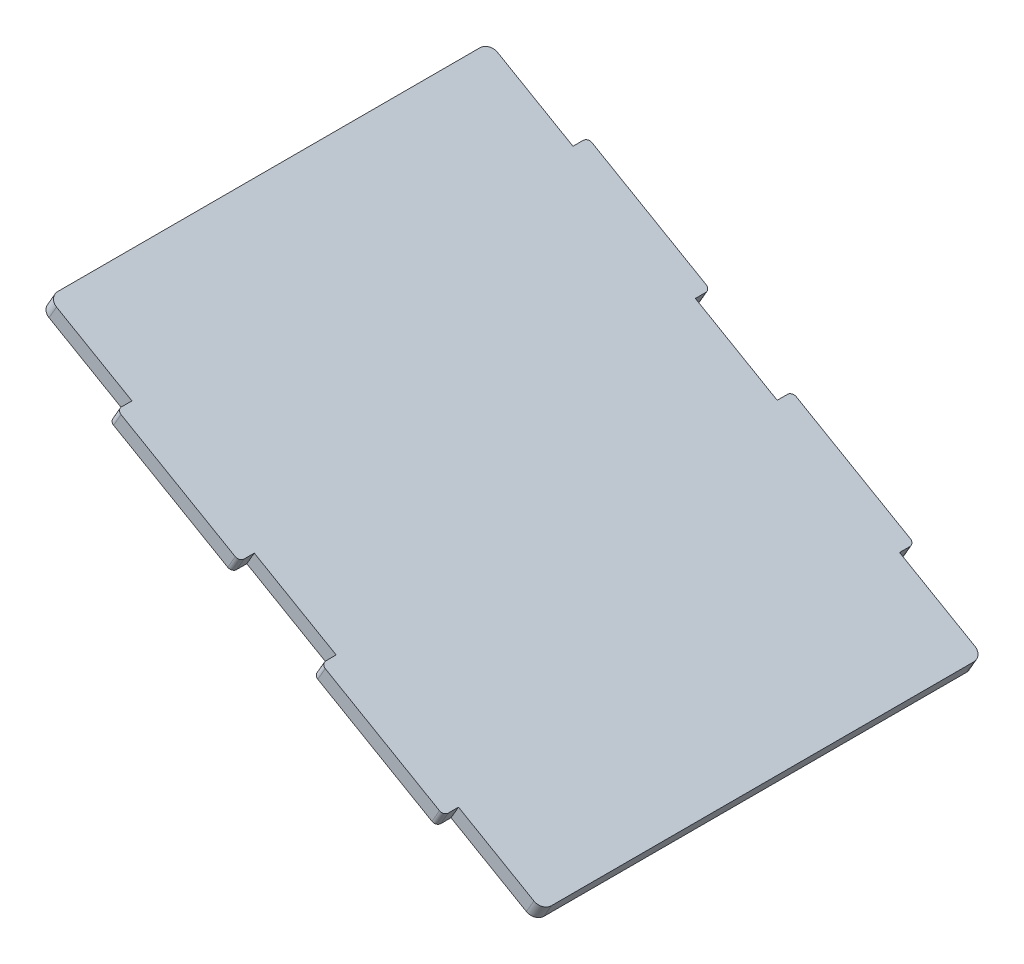
ISO-10303-21;
HEADER;
FILE_DESCRIPTION(('STEP AP214'),'2;1');
FILE_NAME('part.step','',(''),(''),'','','');
FILE_SCHEMA(('AUTOMOTIVE_DESIGN { 1 0 10303 214 1 1 1 1 }'));
ENDSEC;
DATA;
#1=APPLICATION_CONTEXT('core data for automotive mechanical design processes');
#2=APPLICATION_PROTOCOL_DEFINITION('international standard','automotive_design',2000,#1);
#3=PRODUCT_CONTEXT('',#1,'mechanical');
#4=PRODUCT('Part','Part','',(#3));
#5=PRODUCT_RELATED_PRODUCT_CATEGORY('part','',(#4));
#6=PRODUCT_DEFINITION_FORMATION('','',#4);
#7=PRODUCT_DEFINITION_CONTEXT('part definition',#1,'design');
#8=PRODUCT_DEFINITION('design','',#6,#7);
#9=PRODUCT_DEFINITION_SHAPE('','',#8);
#10=(LENGTH_UNIT() NAMED_UNIT(*) SI_UNIT(.MILLI.,.METRE.));
#11=(NAMED_UNIT(*) PLANE_ANGLE_UNIT() SI_UNIT($,.RADIAN.));
#12=(NAMED_UNIT(*) SI_UNIT($,.STERADIAN.) SOLID_ANGLE_UNIT());
#13=UNCERTAINTY_MEASURE_WITH_UNIT(LENGTH_MEASURE(1.E-05),#10,'distance_accuracy_value','');
#14=(GEOMETRIC_REPRESENTATION_CONTEXT(3) GLOBAL_UNCERTAINTY_ASSIGNED_CONTEXT((#13)) GLOBAL_UNIT_ASSIGNED_CONTEXT((#10,
#11,#12)) REPRESENTATION_CONTEXT('',''));
#15=CARTESIAN_POINT('',(0.,0.,0.));
#16=DIRECTION('',(0.,0.,1.));
#17=DIRECTION('',(1.,0.,0.));
#18=AXIS2_PLACEMENT_3D('',#15,#16,#17);
#19=CARTESIAN_POINT('',(0.,0.,1.5875));
#20=DIRECTION('',(0.,0.,-1.));
#21=DIRECTION('',(-1.,0.,0.));
#22=AXIS2_PLACEMENT_3D('',#19,#20,#21);
#23=PLANE('',#22);
#24=DIRECTION('',(0.866025403784438,-0.500000000000001,0.));
#25=VECTOR('',#24,1.);
#26=CARTESIAN_POINT('',(-89.5336436170212,-1.28136737596979,1.5875));
#27=LINE('',#26,#25);
#28=CARTESIAN_POINT('',(-70.925552896104,-12.0247535627964,1.5875));
#29=VERTEX_POINT('',#28);
#30=CARTESIAN_POINT('',(-46.6768415901397,-26.0247535627964,1.5875));
#31=VERTEX_POINT('',#30);
#32=EDGE_CURVE('E407',#29,#31,#27,.T.);
#33=ORIENTED_EDGE('',*,*,#32,.T.);
#34=DIRECTION('',(-0.500000000000002,-0.866025403784437,0.));
#35=VECTOR('',#34,1.);
#36=CARTESIAN_POINT('',(-23.738582336299,13.7054769020424,1.5875));
#37=LINE('',#36,#35);
#38=CARTESIAN_POINT('',(-45.0893415901397,-23.2751229057808,1.5875));
#39=VERTEX_POINT('',#38);
#40=EDGE_CURVE('E41',#31,#39,#37,.F.);
#41=ORIENTED_EDGE('',*,*,#40,.T.);
#42=DIRECTION('',(0.866025403784438,-0.500000000000001,0.));
#43=VECTOR('',#42,1.);
#44=CARTESIAN_POINT('',(-87.9461436170212,1.46826328104581,1.5875));
#45=LINE('',#44,#43);
#46=CARTESIAN_POINT('',(-69.338052896104,-9.27512290578077,1.5875));
#47=VERTEX_POINT('',#46);
#48=EDGE_CURVE('E404',#47,#39,#45,.T.);
#49=ORIENTED_EDGE('',*,*,#48,.F.);
#50=DIRECTION('',(0.500000000000002,0.866025403784437,0.));
#51=VECTOR('',#50,1.);
#52=CARTESIAN_POINT('',(-47.9872936422633,27.7054769020425,1.5875));
#53=LINE('',#52,#51);
#54=EDGE_CURVE('E398',#47,#29,#53,.F.);
#55=ORIENTED_EDGE('',*,*,#54,.T.);
#56=EDGE_LOOP('',(#33,#41,#49,#55));
#57=FACE_BOUND('',#56,.T.);
#58=ADVANCED_FACE('F33',(#57),#23,.F.);
#59=CARTESIAN_POINT('',(16.8788563829788,-59.0524786867569,-222.213793241764));
#60=DIRECTION('',(-0.866025403784439,0.499999999999999,0.));
#61=DIRECTION('',(-0.499999999999999,-0.866025403784439,0.));
#62=AXIS2_PLACEMENT_3D('',#59,#60,#61);
#63=PLANE('',#62);
#64=DIRECTION('',(0.,0.,1.));
#65=VECTOR('',#64,1.);
#66=CARTESIAN_POINT('',(15.2913563829788,-61.8021093437725,-222.213793241764));
#67=LINE('',#66,#65);
#68=CARTESIAN_POINT('',(15.2913563829788,-61.8021093437725,-93.2375));
#69=VERTEX_POINT('',#68);
#70=CARTESIAN_POINT('',(15.2913563829788,-61.8021093437725,-3.58750000000005));
#71=VERTEX_POINT('',#70);
#72=EDGE_CURVE('E415',#69,#71,#67,.T.);
#73=ORIENTED_EDGE('',*,*,#72,.F.);
#74=DIRECTION('',(0.499999999999999,0.866025403784439,0.));
#75=VECTOR('',#74,1.);
#76=CARTESIAN_POINT('',(16.8788563829788,-59.0524786867569,-93.2375));
#77=LINE('',#76,#75);
#78=CARTESIAN_POINT('',(16.8788563829788,-59.0524786867569,-93.2375));
#79=VERTEX_POINT('',#78);
#80=EDGE_CURVE('E303',#69,#79,#77,.T.);
#81=ORIENTED_EDGE('',*,*,#80,.T.);
#82=DIRECTION('',(0.,0.,1.));
#83=VECTOR('',#82,1.);
#84=CARTESIAN_POINT('',(16.8788563829788,-59.0524786867569,-222.213793241764));
#85=LINE('',#84,#83);
#86=CARTESIAN_POINT('',(16.8788563829788,-59.0524786867569,-3.58750000000005));
#87=VERTEX_POINT('',#86);
#88=EDGE_CURVE('E490',#79,#87,#85,.T.);
#89=ORIENTED_EDGE('',*,*,#88,.T.);
#90=DIRECTION('',(0.499999999999999,0.866025403784439,0.));
#91=VECTOR('',#90,1.);
#92=CARTESIAN_POINT('',(15.2913563829788,-61.8021093437725,-3.5875));
#93=LINE('',#92,#91);
#94=EDGE_CURVE('E301',#87,#71,#93,.F.);
#95=ORIENTED_EDGE('',*,*,#94,.T.);
#96=EDGE_LOOP('',(#73,#81,#89,#95));
#97=FACE_BOUND('',#96,.T.);
#98=ADVANCED_FACE('F580',(#97),#63,.F.);
#99=CARTESIAN_POINT('',(-87.9461436170212,1.46826328104581,-222.213793241764));
#100=DIRECTION('',(-0.500000000000001,-0.866025403784438,0.));
#101=DIRECTION('',(0.866025403784438,-0.500000000000001,0.));
#102=AXIS2_PLACEMENT_3D('',#99,#100,#101);
#103=PLANE('',#102);
#104=DIRECTION('',(-0.866025403784438,0.500000000000001,0.));
#105=VECTOR('',#104,1.);
#106=CARTESIAN_POINT('',(-87.9461436170212,1.46826328104581,-98.4125));
#107=LINE('',#106,#105);
#108=CARTESIAN_POINT('',(-45.0893415901397,-23.2751229057808,-98.4125));
#109=VERTEX_POINT('',#108);
#110=CARTESIAN_POINT('',(-69.338052896104,-9.27512290578076,-98.4125));
#111=VERTEX_POINT('',#110);
#112=EDGE_CURVE('E479',#109,#111,#107,.T.);
#113=ORIENTED_EDGE('',*,*,#112,.T.);
#114=CARTESIAN_POINT('',(-69.338052896104,-9.27512290578076,-97.4125));
#115=DIRECTION('',(-0.500000000000001,-0.866025403784438,0.));
#116=DIRECTION('',(0.866025403784438,-0.500000000000001,0.));
#117=AXIS2_PLACEMENT_3D('',#114,#115,#116);
#118=CIRCLE('',#117,1.);
#119=CARTESIAN_POINT('',(-70.2040782998884,-8.77512290578076,-97.4125));
#120=VERTEX_POINT('',#119);
#121=EDGE_CURVE('E357',#111,#120,#118,.F.);
#122=ORIENTED_EDGE('',*,*,#121,.T.);
#123=DIRECTION('',(0.,0.,1.));
#124=VECTOR('',#123,1.);
#125=CARTESIAN_POINT('',(-70.2040782998884,-8.77512290578076,-222.213793241764));
#126=LINE('',#125,#124);
#127=CARTESIAN_POINT('',(-70.2040782998884,-8.77512290578076,-95.2375));
#128=VERTEX_POINT('',#127);
#129=EDGE_CURVE('E459',#120,#128,#126,.T.);
#130=ORIENTED_EDGE('',*,*,#129,.T.);
#131=DIRECTION('',(-0.866025403784438,0.500000000000001,0.));
#132=VECTOR('',#131,1.);
#133=CARTESIAN_POINT('',(-87.9461436170212,1.46826328104581,-95.2375));
#134=LINE('',#133,#132);
#135=CARTESIAN_POINT('',(-86.2140928094523,0.4682632810458,-95.2375));
#136=VERTEX_POINT('',#135);
#137=EDGE_CURVE('E461',#128,#136,#134,.T.);
#138=ORIENTED_EDGE('',*,*,#137,.T.);
#139=CARTESIAN_POINT('',(-86.2140928094523,0.468263281045801,-93.2375));
#140=DIRECTION('',(-0.500000000000001,-0.866025403784438,0.));
#141=DIRECTION('',(0.866025403784438,-0.500000000000001,0.));
#142=AXIS2_PLACEMENT_3D('',#139,#140,#141);
#143=CIRCLE('',#142,2.);
#144=CARTESIAN_POINT('',(-87.9461436170212,1.46826328104581,-93.2375));
#145=VERTEX_POINT('',#144);
#146=EDGE_CURVE('E308',#136,#145,#143,.F.);
#147=ORIENTED_EDGE('',*,*,#146,.T.);
#148=DIRECTION('',(0.,0.,1.));
#149=VECTOR('',#148,1.);
#150=CARTESIAN_POINT('',(-87.9461436170212,1.46826328104581,-222.213793241764));
#151=LINE('',#150,#149);
#152=CARTESIAN_POINT('',(-87.9461436170212,1.46826328104581,-3.58750000000005));
#153=VERTEX_POINT('',#152);
#154=EDGE_CURVE('E487',#145,#153,#151,.T.);
#155=ORIENTED_EDGE('',*,*,#154,.T.);
#156=CARTESIAN_POINT('',(-86.2140928094524,0.468263281045801,-3.5875));
#157=DIRECTION('',(-0.500000000000001,-0.866025403784438,0.));
#158=DIRECTION('',(0.866025403784438,-0.500000000000001,0.));
#159=AXIS2_PLACEMENT_3D('',#156,#157,#158);
#160=CIRCLE('',#159,2.);
#161=CARTESIAN_POINT('',(-86.2140928094523,0.4682632810458,-1.58749999999999));
#162=VERTEX_POINT('',#161);
#163=EDGE_CURVE('E306',#153,#162,#160,.F.);
#164=ORIENTED_EDGE('',*,*,#163,.T.);
#165=DIRECTION('',(-0.866025403784438,0.500000000000001,0.));
#166=VECTOR('',#165,1.);
#167=CARTESIAN_POINT('',(-87.9461436170212,1.46826328104581,-1.58749999999999));
#168=LINE('',#167,#166);
#169=CARTESIAN_POINT('',(-70.2040782998884,-8.77512290578076,-1.5875));
#170=VERTEX_POINT('',#169);
#171=EDGE_CURVE('E473',#170,#162,#168,.T.);
#172=ORIENTED_EDGE('',*,*,#171,.F.);
#173=DIRECTION('',(0.,0.,1.));
#174=VECTOR('',#173,1.);
#175=CARTESIAN_POINT('',(-70.2040782998884,-8.77512290578076,-222.213793241764));
#176=LINE('',#175,#174);
#177=CARTESIAN_POINT('',(-70.2040782998884,-8.77512290578076,0.587499999999991));
#178=VERTEX_POINT('',#177);
#179=EDGE_CURVE('E471',#170,#178,#176,.T.);
#180=ORIENTED_EDGE('',*,*,#179,.T.);
#181=CARTESIAN_POINT('',(-69.338052896104,-9.27512290578076,0.5875));
#182=DIRECTION('',(-0.500000000000001,-0.866025403784438,0.));
#183=DIRECTION('',(0.866025403784438,-0.500000000000001,0.));
#184=AXIS2_PLACEMENT_3D('',#181,#182,#183);
#185=CIRCLE('',#184,1.);
#186=EDGE_CURVE('E343',#178,#47,#185,.F.);
#187=ORIENTED_EDGE('',*,*,#186,.T.);
#188=ORIENTED_EDGE('',*,*,#48,.T.);
#189=CARTESIAN_POINT('',(-45.0893415901397,-23.2751229057808,0.5875));
#190=DIRECTION('',(-0.500000000000001,-0.866025403784438,0.));
#191=DIRECTION('',(0.866025403784438,-0.500000000000001,0.));
#192=AXIS2_PLACEMENT_3D('',#189,#190,#191);
#193=CIRCLE('',#192,1.);
#194=CARTESIAN_POINT('',(-44.2233161863553,-23.7751229057808,0.587499999999991));
#195=VERTEX_POINT('',#194);
#196=EDGE_CURVE('E345',#39,#195,#193,.F.);
#197=ORIENTED_EDGE('',*,*,#196,.T.);
#198=DIRECTION('',(0.,0.,-1.));
#199=VECTOR('',#198,1.);
#200=CARTESIAN_POINT('',(-44.2233161863553,-23.7751229057808,-222.213793241764));
#201=LINE('',#200,#199);
#202=CARTESIAN_POINT('',(-44.2233161863553,-23.7751229057808,-1.5875));
#203=VERTEX_POINT('',#202);
#204=EDGE_CURVE('E425',#195,#203,#201,.T.);
#205=ORIENTED_EDGE('',*,*,#204,.T.);
#206=CARTESIAN_POINT('',(-26.8439710476872,-33.8090924999303,-1.5875));
#207=VERTEX_POINT('',#206);
#208=EDGE_CURVE('E433',#207,#203,#168,.T.);
#209=ORIENTED_EDGE('',*,*,#208,.F.);
#210=DIRECTION('',(0.,0.,1.));
#211=VECTOR('',#210,1.);
#212=CARTESIAN_POINT('',(-26.8439710476872,-33.8090924999303,-222.213793241764));
#213=LINE('',#212,#211);
#214=CARTESIAN_POINT('',(-26.8439710476872,-33.8090924999303,0.587499999999991));
#215=VERTEX_POINT('',#214);
#216=EDGE_CURVE('E465',#207,#215,#213,.T.);
#217=ORIENTED_EDGE('',*,*,#216,.T.);
#218=CARTESIAN_POINT('',(-25.9779456439027,-34.3090924999303,0.5875));
#219=DIRECTION('',(-0.500000000000001,-0.866025403784438,0.));
#220=DIRECTION('',(0.866025403784438,-0.500000000000001,0.));
#221=AXIS2_PLACEMENT_3D('',#218,#219,#220);
#222=CIRCLE('',#221,1.);
#223=CARTESIAN_POINT('',(-25.9779456439027,-34.3090924999303,1.5875));
#224=VERTEX_POINT('',#223);
#225=EDGE_CURVE('E347',#215,#224,#222,.F.);
#226=ORIENTED_EDGE('',*,*,#225,.T.);
#227=CARTESIAN_POINT('',(-1.72923433793847,-48.3090924999303,1.5875));
#228=VERTEX_POINT('',#227);
#229=EDGE_CURVE('E416',#224,#228,#45,.T.);
#230=ORIENTED_EDGE('',*,*,#229,.T.);
#231=CARTESIAN_POINT('',(-1.72923433793849,-48.3090924999303,0.5875));
#232=DIRECTION('',(-0.500000000000001,-0.866025403784438,0.));
#233=DIRECTION('',(0.866025403784438,-0.500000000000001,0.));
#234=AXIS2_PLACEMENT_3D('',#231,#232,#233);
#235=CIRCLE('',#234,1.);
#236=CARTESIAN_POINT('',(-0.863208934154064,-48.8090924999303,0.587499999999991));
#237=VERTEX_POINT('',#236);
#238=EDGE_CURVE('E349',#228,#237,#235,.F.);
#239=ORIENTED_EDGE('',*,*,#238,.T.);
#240=DIRECTION('',(0.,0.,-1.));
#241=VECTOR('',#240,1.);
#242=CARTESIAN_POINT('',(-0.863208934154064,-48.8090924999303,-222.213793241764));
#243=LINE('',#242,#241);
#244=CARTESIAN_POINT('',(-0.86320893415405,-48.8090924999303,-1.5875));
#245=VERTEX_POINT('',#244);
#246=EDGE_CURVE('E468',#237,#245,#243,.T.);
#247=ORIENTED_EDGE('',*,*,#246,.T.);
#248=CARTESIAN_POINT('',(15.1468055754099,-58.0524786867569,-1.58749999999999));
#249=VERTEX_POINT('',#248);
#250=EDGE_CURVE('E476',#249,#245,#168,.T.);
#251=ORIENTED_EDGE('',*,*,#250,.F.);
#252=CARTESIAN_POINT('',(15.1468055754099,-58.0524786867569,-3.5875));
#253=DIRECTION('',(-0.500000000000001,-0.866025403784438,0.));
#254=DIRECTION('',(0.866025403784438,-0.500000000000001,0.));
#255=AXIS2_PLACEMENT_3D('',#252,#253,#254);
#256=CIRCLE('',#255,2.);
#257=EDGE_CURVE('E310',#249,#87,#256,.F.);
#258=ORIENTED_EDGE('',*,*,#257,.T.);
#259=ORIENTED_EDGE('',*,*,#88,.F.);
#260=CARTESIAN_POINT('',(15.1468055754099,-58.0524786867569,-93.2375));
#261=DIRECTION('',(-0.500000000000001,-0.866025403784438,0.));
#262=DIRECTION('',(0.866025403784438,-0.500000000000001,0.));
#263=AXIS2_PLACEMENT_3D('',#260,#261,#262);
#264=CIRCLE('',#263,2.);
#265=CARTESIAN_POINT('',(15.1468055754099,-58.0524786867569,-95.2375));
#266=VERTEX_POINT('',#265);
#267=EDGE_CURVE('E312',#79,#266,#264,.F.);
#268=ORIENTED_EDGE('',*,*,#267,.T.);
#269=CARTESIAN_POINT('',(-0.863208934154045,-48.8090924999303,-95.2375));
#270=VERTEX_POINT('',#269);
#271=EDGE_CURVE('E464',#266,#270,#134,.T.);
#272=ORIENTED_EDGE('',*,*,#271,.T.);
#273=DIRECTION('',(0.,0.,-1.));
#274=VECTOR('',#273,1.);
#275=CARTESIAN_POINT('',(-0.863208934154064,-48.8090924999303,-222.213793241764));
#276=LINE('',#275,#274);
#277=CARTESIAN_POINT('',(-0.863208934154064,-48.8090924999303,-97.4125));
#278=VERTEX_POINT('',#277);
#279=EDGE_CURVE('E450',#270,#278,#276,.T.);
#280=ORIENTED_EDGE('',*,*,#279,.T.);
#281=CARTESIAN_POINT('',(-1.72923433793848,-48.3090924999303,-97.4125));
#282=DIRECTION('',(-0.500000000000001,-0.866025403784438,0.));
#283=DIRECTION('',(0.866025403784438,-0.500000000000001,0.));
#284=AXIS2_PLACEMENT_3D('',#281,#282,#283);
#285=CIRCLE('',#284,1.);
#286=CARTESIAN_POINT('',(-1.72923433793848,-48.3090924999303,-98.4125));
#287=VERTEX_POINT('',#286);
#288=EDGE_CURVE('E351',#278,#287,#285,.F.);
#289=ORIENTED_EDGE('',*,*,#288,.T.);
#290=CARTESIAN_POINT('',(-25.9779456439027,-34.3090924999303,-98.4125));
#291=VERTEX_POINT('',#290);
#292=EDGE_CURVE('E477',#287,#291,#107,.T.);
#293=ORIENTED_EDGE('',*,*,#292,.T.);
#294=CARTESIAN_POINT('',(-25.9779456439027,-34.3090924999303,-97.4125));
#295=DIRECTION('',(-0.500000000000001,-0.866025403784438,0.));
#296=DIRECTION('',(0.866025403784438,-0.500000000000001,0.));
#297=AXIS2_PLACEMENT_3D('',#294,#295,#296);
#298=CIRCLE('',#297,1.);
#299=CARTESIAN_POINT('',(-26.8439710476872,-33.8090924999303,-97.4125));
#300=VERTEX_POINT('',#299);
#301=EDGE_CURVE('E353',#291,#300,#298,.F.);
#302=ORIENTED_EDGE('',*,*,#301,.T.);
#303=DIRECTION('',(0.,0.,1.));
#304=VECTOR('',#303,1.);
#305=CARTESIAN_POINT('',(-26.8439710476872,-33.8090924999303,-222.213793241764));
#306=LINE('',#305,#304);
#307=CARTESIAN_POINT('',(-26.8439710476872,-33.8090924999303,-95.2375));
#308=VERTEX_POINT('',#307);
#309=EDGE_CURVE('E250',#300,#308,#306,.T.);
#310=ORIENTED_EDGE('',*,*,#309,.T.);
#311=CARTESIAN_POINT('',(-44.2233161863553,-23.7751229057808,-95.2375));
#312=VERTEX_POINT('',#311);
#313=EDGE_CURVE('E260',#308,#312,#134,.T.);
#314=ORIENTED_EDGE('',*,*,#313,.T.);
#315=DIRECTION('',(0.,0.,-1.));
#316=VECTOR('',#315,1.);
#317=CARTESIAN_POINT('',(-44.2233161863553,-23.7751229057808,-222.213793241764));
#318=LINE('',#317,#316);
#319=CARTESIAN_POINT('',(-44.2233161863553,-23.7751229057808,-97.4125));
#320=VERTEX_POINT('',#319);
#321=EDGE_CURVE('E454',#312,#320,#318,.T.);
#322=ORIENTED_EDGE('',*,*,#321,.T.);
#323=CARTESIAN_POINT('',(-45.0893415901397,-23.2751229057808,-97.4125));
#324=DIRECTION('',(-0.500000000000001,-0.866025403784438,0.));
#325=DIRECTION('',(0.866025403784438,-0.500000000000001,0.));
#326=AXIS2_PLACEMENT_3D('',#323,#324,#325);
#327=CIRCLE('',#326,1.);
#328=EDGE_CURVE('E355',#320,#109,#327,.F.);
#329=ORIENTED_EDGE('',*,*,#328,.T.);
#330=EDGE_LOOP('',(#113,#122,#130,#138,#147,#155,#164,#172,#180,#187,#188,#197,#205,#209,#217,
#226,#230,#239,#247,#251,#258,#259,#268,#272,#280,#289,#293,#302,#310,#314,#322,#329));
#331=FACE_BOUND('',#330,.T.);
#332=ADVANCED_FACE('F412',(#331),#103,.F.);
#333=CARTESIAN_POINT('',(-89.5336436170212,-1.28136737596979,-222.213793241764));
#334=DIRECTION('',(0.86602540378444,-0.499999999999998,0.));
#335=DIRECTION('',(0.499999999999998,0.86602540378444,0.));
#336=AXIS2_PLACEMENT_3D('',#333,#334,#335);
#337=PLANE('',#336);
#338=ORIENTED_EDGE('',*,*,#154,.F.);
#339=DIRECTION('',(-0.499999999999998,-0.86602540378444,0.));
#340=VECTOR('',#339,1.);
#341=CARTESIAN_POINT('',(-89.5336436170212,-1.28136737596979,-93.2375));
#342=LINE('',#341,#340);
#343=CARTESIAN_POINT('',(-89.5336436170212,-1.28136737596979,-93.2375));
#344=VERTEX_POINT('',#343);
#345=EDGE_CURVE('E329',#145,#344,#342,.T.);
#346=ORIENTED_EDGE('',*,*,#345,.T.);
#347=DIRECTION('',(0.,0.,1.));
#348=VECTOR('',#347,1.);
#349=CARTESIAN_POINT('',(-89.5336436170212,-1.28136737596979,-222.213793241764));
#350=LINE('',#349,#348);
#351=CARTESIAN_POINT('',(-89.5336436170212,-1.28136737596979,-3.58750000000005));
#352=VERTEX_POINT('',#351);
#353=EDGE_CURVE('E484',#344,#352,#350,.T.);
#354=ORIENTED_EDGE('',*,*,#353,.T.);
#355=DIRECTION('',(-0.499999999999998,-0.86602540378444,0.));
#356=VECTOR('',#355,1.);
#357=CARTESIAN_POINT('',(-87.9461436170212,1.46826328104579,-3.5875));
#358=LINE('',#357,#356);
#359=EDGE_CURVE('E327',#352,#153,#358,.F.);
#360=ORIENTED_EDGE('',*,*,#359,.T.);
#361=EDGE_LOOP('',(#338,#346,#354,#360));
#362=FACE_BOUND('',#361,.T.);
#363=ADVANCED_FACE('F543',(#362),#337,.F.);
#364=CARTESIAN_POINT('',(-89.5336436170212,-1.28136737596979,-222.213793241764));
#365=DIRECTION('',(-0.500000000000001,-0.866025403784438,0.));
#366=DIRECTION('',(0.866025403784438,-0.500000000000001,0.));
#367=AXIS2_PLACEMENT_3D('',#364,#365,#366);
#368=PLANE('',#367);
#369=DIRECTION('',(0.,0.,1.));
#370=VECTOR('',#369,1.);
#371=CARTESIAN_POINT('',(-71.7915782998884,-11.5247535627963,-222.213793241764));
#372=LINE('',#371,#370);
#373=CARTESIAN_POINT('',(-71.7915782998884,-11.5247535627963,-97.4125));
#374=VERTEX_POINT('',#373);
#375=CARTESIAN_POINT('',(-71.7915782998884,-11.5247535627963,-95.2375));
#376=VERTEX_POINT('',#375);
#377=EDGE_CURVE('E457',#374,#376,#372,.T.);
#378=ORIENTED_EDGE('',*,*,#377,.F.);
#379=CARTESIAN_POINT('',(-70.925552896104,-12.0247535627964,-97.4125));
#380=DIRECTION('',(-0.500000000000001,-0.866025403784438,0.));
#381=DIRECTION('',(0.866025403784438,-0.500000000000001,0.));
#382=AXIS2_PLACEMENT_3D('',#379,#380,#381);
#383=CIRCLE('',#382,1.);
#384=CARTESIAN_POINT('',(-70.925552896104,-12.0247535627963,-98.4125));
#385=VERTEX_POINT('',#384);
#386=EDGE_CURVE('E373',#374,#385,#383,.T.);
#387=ORIENTED_EDGE('',*,*,#386,.T.);
#388=DIRECTION('',(-0.866025403784438,0.500000000000001,0.));
#389=VECTOR('',#388,1.);
#390=CARTESIAN_POINT('',(-89.5336436170212,-1.28136737596979,-98.4125));
#391=LINE('',#390,#389);
#392=CARTESIAN_POINT('',(-46.6768415901397,-26.0247535627964,-98.4125));
#393=VERTEX_POINT('',#392);
#394=EDGE_CURVE('E273',#393,#385,#391,.T.);
#395=ORIENTED_EDGE('',*,*,#394,.F.);
#396=CARTESIAN_POINT('',(-46.6768415901397,-26.0247535627964,-97.4125));
#397=DIRECTION('',(-0.500000000000001,-0.866025403784438,0.));
#398=DIRECTION('',(0.866025403784438,-0.500000000000001,0.));
#399=AXIS2_PLACEMENT_3D('',#396,#397,#398);
#400=CIRCLE('',#399,1.);
#401=CARTESIAN_POINT('',(-45.8108161863553,-26.5247535627964,-97.4125));
#402=VERTEX_POINT('',#401);
#403=EDGE_CURVE('E371',#393,#402,#400,.T.);
#404=ORIENTED_EDGE('',*,*,#403,.T.);
#405=DIRECTION('',(0.,0.,-1.));
#406=VECTOR('',#405,1.);
#407=CARTESIAN_POINT('',(-45.8108161863553,-26.5247535627964,-222.213793241764));
#408=LINE('',#407,#406);
#409=CARTESIAN_POINT('',(-45.8108161863553,-26.5247535627964,-95.2375));
#410=VERTEX_POINT('',#409);
#411=EDGE_CURVE('E268',#410,#402,#408,.T.);
#412=ORIENTED_EDGE('',*,*,#411,.F.);
#413=DIRECTION('',(-0.866025403784438,0.500000000000001,0.));
#414=VECTOR('',#413,1.);
#415=CARTESIAN_POINT('',(-89.5336436170212,-1.28136737596979,-95.2375));
#416=LINE('',#415,#414);
#417=CARTESIAN_POINT('',(-28.4314710476872,-36.5587231569459,-95.2375));
#418=VERTEX_POINT('',#417);
#419=EDGE_CURVE('E257',#418,#410,#416,.T.);
#420=ORIENTED_EDGE('',*,*,#419,.F.);
#421=DIRECTION('',(0.,0.,1.));
#422=VECTOR('',#421,1.);
#423=CARTESIAN_POINT('',(-28.4314710476872,-36.5587231569459,-222.213793241764));
#424=LINE('',#423,#422);
#425=CARTESIAN_POINT('',(-28.4314710476872,-36.5587231569459,-97.4125));
#426=VERTEX_POINT('',#425);
#427=EDGE_CURVE('E242',#426,#418,#424,.T.);
#428=ORIENTED_EDGE('',*,*,#427,.F.);
#429=CARTESIAN_POINT('',(-27.5654456439027,-37.0587231569459,-97.4125));
#430=DIRECTION('',(-0.500000000000001,-0.866025403784438,0.));
#431=DIRECTION('',(0.866025403784438,-0.500000000000001,0.));
#432=AXIS2_PLACEMENT_3D('',#429,#430,#431);
#433=CIRCLE('',#432,1.);
#434=CARTESIAN_POINT('',(-27.5654456439027,-37.0587231569458,-98.4125));
#435=VERTEX_POINT('',#434);
#436=EDGE_CURVE('E54',#426,#435,#433,.T.);
#437=ORIENTED_EDGE('',*,*,#436,.T.);
#438=CARTESIAN_POINT('',(-3.3167343379385,-51.0587231569459,-98.4125));
#439=VERTEX_POINT('',#438);
#440=EDGE_CURVE('E270',#439,#435,#391,.T.);
#441=ORIENTED_EDGE('',*,*,#440,.F.);
#442=CARTESIAN_POINT('',(-3.31673433793848,-51.0587231569459,-97.4125));
#443=DIRECTION('',(-0.500000000000001,-0.866025403784438,0.));
#444=DIRECTION('',(0.866025403784438,-0.500000000000001,0.));
#445=AXIS2_PLACEMENT_3D('',#442,#443,#444);
#446=CIRCLE('',#445,1.);
#447=CARTESIAN_POINT('',(-2.45070893415406,-51.5587231569459,-97.4125));
#448=VERTEX_POINT('',#447);
#449=EDGE_CURVE('E48',#439,#448,#446,.T.);
#450=ORIENTED_EDGE('',*,*,#449,.T.);
#451=DIRECTION('',(0.,0.,-1.));
#452=VECTOR('',#451,1.);
#453=CARTESIAN_POINT('',(-2.45070893415406,-51.5587231569459,-222.213793241764));
#454=LINE('',#453,#452);
#455=CARTESIAN_POINT('',(-2.45070893415404,-51.5587231569459,-95.2375));
#456=VERTEX_POINT('',#455);
#457=EDGE_CURVE('E448',#456,#448,#454,.T.);
#458=ORIENTED_EDGE('',*,*,#457,.F.);
#459=CARTESIAN_POINT('',(13.5593055754099,-60.8021093437725,-95.2375));
#460=VERTEX_POINT('',#459);
#461=EDGE_CURVE('E269',#460,#456,#416,.T.);
#462=ORIENTED_EDGE('',*,*,#461,.F.);
#463=CARTESIAN_POINT('',(13.5593055754099,-60.8021093437725,-93.2375));
#464=DIRECTION('',(-0.500000000000001,-0.866025403784438,0.));
#465=DIRECTION('',(0.866025403784438,-0.500000000000001,0.));
#466=AXIS2_PLACEMENT_3D('',#463,#464,#465);
#467=CIRCLE('',#466,2.);
#468=EDGE_CURVE('E322',#460,#69,#467,.T.);
#469=ORIENTED_EDGE('',*,*,#468,.T.);
#470=ORIENTED_EDGE('',*,*,#72,.T.);
#471=CARTESIAN_POINT('',(13.5593055754099,-60.8021093437725,-3.5875));
#472=DIRECTION('',(-0.500000000000001,-0.866025403784438,0.));
#473=DIRECTION('',(0.866025403784438,-0.500000000000001,0.));
#474=AXIS2_PLACEMENT_3D('',#471,#472,#473);
#475=CIRCLE('',#474,2.);
#476=CARTESIAN_POINT('',(13.5593055754099,-60.8021093437725,-1.58749999999999));
#477=VERTEX_POINT('',#476);
#478=EDGE_CURVE('E320',#71,#477,#475,.T.);
#479=ORIENTED_EDGE('',*,*,#478,.T.);
#480=DIRECTION('',(-0.866025403784438,0.500000000000001,0.));
#481=VECTOR('',#480,1.);
#482=CARTESIAN_POINT('',(-89.5336436170212,-1.28136737596979,-1.58749999999999));
#483=LINE('',#482,#481);
#484=CARTESIAN_POINT('',(-2.45070893415405,-51.5587231569459,-1.5875));
#485=VERTEX_POINT('',#484);
#486=EDGE_CURVE('E292',#477,#485,#483,.T.);
#487=ORIENTED_EDGE('',*,*,#486,.T.);
#488=DIRECTION('',(0.,0.,-1.));
#489=VECTOR('',#488,1.);
#490=CARTESIAN_POINT('',(-2.45070893415406,-51.5587231569459,-222.213793241764));
#491=LINE('',#490,#489);
#492=CARTESIAN_POINT('',(-2.45070893415406,-51.5587231569459,0.587499999999991));
#493=VERTEX_POINT('',#492);
#494=EDGE_CURVE('E296',#493,#485,#491,.T.);
#495=ORIENTED_EDGE('',*,*,#494,.F.);
#496=CARTESIAN_POINT('',(-3.31673433793848,-51.0587231569459,0.5875));
#497=DIRECTION('',(-0.500000000000001,-0.866025403784438,0.));
#498=DIRECTION('',(0.866025403784438,-0.500000000000001,0.));
#499=AXIS2_PLACEMENT_3D('',#496,#497,#498);
#500=CIRCLE('',#499,1.);
#501=CARTESIAN_POINT('',(-3.31673433793847,-51.0587231569459,1.5875));
#502=VERTEX_POINT('',#501);
#503=EDGE_CURVE('E367',#493,#502,#500,.T.);
#504=ORIENTED_EDGE('',*,*,#503,.T.);
#505=CARTESIAN_POINT('',(-27.5654456439027,-37.0587231569459,1.5875));
#506=VERTEX_POINT('',#505);
#507=EDGE_CURVE('E481',#506,#502,#27,.T.);
#508=ORIENTED_EDGE('',*,*,#507,.F.);
#509=CARTESIAN_POINT('',(-27.5654456439027,-37.0587231569459,0.5875));
#510=DIRECTION('',(-0.500000000000001,-0.866025403784438,0.));
#511=DIRECTION('',(0.866025403784438,-0.500000000000001,0.));
#512=AXIS2_PLACEMENT_3D('',#509,#510,#511);
#513=CIRCLE('',#512,1.);
#514=CARTESIAN_POINT('',(-28.4314710476872,-36.5587231569459,0.587499999999991));
#515=VERTEX_POINT('',#514);
#516=EDGE_CURVE('E365',#506,#515,#513,.T.);
#517=ORIENTED_EDGE('',*,*,#516,.T.);
#518=DIRECTION('',(0.,0.,1.));
#519=VECTOR('',#518,1.);
#520=CARTESIAN_POINT('',(-28.4314710476872,-36.5587231569459,-222.213793241764));
#521=LINE('',#520,#519);
#522=CARTESIAN_POINT('',(-28.4314710476872,-36.5587231569459,-1.58749999999999));
#523=VERTEX_POINT('',#522);
#524=EDGE_CURVE('E278',#523,#515,#521,.T.);
#525=ORIENTED_EDGE('',*,*,#524,.F.);
#526=CARTESIAN_POINT('',(-45.8108161863553,-26.5247535627964,-1.5875));
#527=VERTEX_POINT('',#526);
#528=EDGE_CURVE('E284',#523,#527,#483,.T.);
#529=ORIENTED_EDGE('',*,*,#528,.T.);
#530=DIRECTION('',(0.,0.,-1.));
#531=VECTOR('',#530,1.);
#532=CARTESIAN_POINT('',(-45.8108161863553,-26.5247535627964,-222.213793241764));
#533=LINE('',#532,#531);
#534=CARTESIAN_POINT('',(-45.8108161863553,-26.5247535627964,0.587499999999991));
#535=VERTEX_POINT('',#534);
#536=EDGE_CURVE('E290',#535,#527,#533,.T.);
#537=ORIENTED_EDGE('',*,*,#536,.F.);
#538=CARTESIAN_POINT('',(-46.6768415901397,-26.0247535627964,0.5875));
#539=DIRECTION('',(-0.500000000000001,-0.866025403784438,0.));
#540=DIRECTION('',(0.866025403784438,-0.500000000000001,0.));
#541=AXIS2_PLACEMENT_3D('',#538,#539,#540);
#542=CIRCLE('',#541,1.);
#543=EDGE_CURVE('E363',#535,#31,#542,.T.);
#544=ORIENTED_EDGE('',*,*,#543,.T.);
#545=ORIENTED_EDGE('',*,*,#32,.F.);
#546=CARTESIAN_POINT('',(-70.925552896104,-12.0247535627963,0.5875));
#547=DIRECTION('',(-0.500000000000001,-0.866025403784438,0.));
#548=DIRECTION('',(0.866025403784438,-0.500000000000001,0.));
#549=AXIS2_PLACEMENT_3D('',#546,#547,#548);
#550=CIRCLE('',#549,1.);
#551=CARTESIAN_POINT('',(-71.7915782998884,-11.5247535627963,0.587499999999991));
#552=VERTEX_POINT('',#551);
#553=EDGE_CURVE('E361',#29,#552,#550,.T.);
#554=ORIENTED_EDGE('',*,*,#553,.T.);
#555=DIRECTION('',(0.,0.,1.));
#556=VECTOR('',#555,1.);
#557=CARTESIAN_POINT('',(-71.7915782998884,-11.5247535627963,-222.213793241764));
#558=LINE('',#557,#556);
#559=CARTESIAN_POINT('',(-71.7915782998884,-11.5247535627963,-1.58749999999999));
#560=VERTEX_POINT('',#559);
#561=EDGE_CURVE('E298',#560,#552,#558,.T.);
#562=ORIENTED_EDGE('',*,*,#561,.F.);
#563=CARTESIAN_POINT('',(-87.8015928094523,-2.28136737596979,-1.58749999999999));
#564=VERTEX_POINT('',#563);
#565=EDGE_CURVE('E293',#560,#564,#483,.T.);
#566=ORIENTED_EDGE('',*,*,#565,.T.);
#567=CARTESIAN_POINT('',(-87.8015928094523,-2.2813673759698,-3.5875));
#568=DIRECTION('',(-0.500000000000001,-0.866025403784438,0.));
#569=DIRECTION('',(0.866025403784438,-0.500000000000001,0.));
#570=AXIS2_PLACEMENT_3D('',#567,#568,#569);
#571=CIRCLE('',#570,2.);
#572=EDGE_CURVE('E316',#564,#352,#571,.T.);
#573=ORIENTED_EDGE('',*,*,#572,.T.);
#574=ORIENTED_EDGE('',*,*,#353,.F.);
#575=CARTESIAN_POINT('',(-87.8015928094523,-2.28136737596979,-93.2375));
#576=DIRECTION('',(-0.500000000000001,-0.866025403784438,0.));
#577=DIRECTION('',(0.866025403784438,-0.500000000000001,0.));
#578=AXIS2_PLACEMENT_3D('',#575,#576,#577);
#579=CIRCLE('',#578,2.);
#580=CARTESIAN_POINT('',(-87.8015928094523,-2.28136737596979,-95.2375));
#581=VERTEX_POINT('',#580);
#582=EDGE_CURVE('E318',#344,#581,#579,.T.);
#583=ORIENTED_EDGE('',*,*,#582,.T.);
#584=EDGE_CURVE('E272',#376,#581,#416,.T.);
#585=ORIENTED_EDGE('',*,*,#584,.F.);
#586=EDGE_LOOP('',(#378,#387,#395,#404,#412,#420,#428,#437,#441,#450,#458,#462,#469,#470,#479,
#487,#495,#504,#508,#517,#525,#529,#537,#544,#545,#554,#562,#566,#573,#574,#583,#585));
#587=FACE_BOUND('',#586,.T.);
#588=ADVANCED_FACE('F266',(#587),#368,.T.);
#589=CARTESIAN_POINT('',(0.,0.,-98.4125));
#590=DIRECTION('',(0.,0.,1.));
#591=DIRECTION('',(1.,0.,0.));
#592=AXIS2_PLACEMENT_3D('',#589,#590,#591);
#593=PLANE('',#592);
#594=ORIENTED_EDGE('',*,*,#394,.T.);
#595=DIRECTION('',(0.500000000000002,0.866025403784437,0.));
#596=VECTOR('',#595,1.);
#597=CARTESIAN_POINT('',(-47.9872936422633,27.7054769020425,-98.4125));
#598=LINE('',#597,#596);
#599=EDGE_CURVE('E340',#385,#111,#598,.T.);
#600=ORIENTED_EDGE('',*,*,#599,.T.);
#601=ORIENTED_EDGE('',*,*,#112,.F.);
#602=DIRECTION('',(-0.500000000000002,-0.866025403784437,0.));
#603=VECTOR('',#602,1.);
#604=CARTESIAN_POINT('',(-23.738582336299,13.7054769020424,-98.4125));
#605=LINE('',#604,#603);
#606=EDGE_CURVE('E337',#109,#393,#605,.T.);
#607=ORIENTED_EDGE('',*,*,#606,.T.);
#608=EDGE_LOOP('',(#594,#600,#601,#607));
#609=FACE_BOUND('',#608,.T.);
#610=ADVANCED_FACE('F559',(#609),#593,.F.);
#611=ORIENTED_EDGE('',*,*,#507,.T.);
#612=DIRECTION('',(-0.5,-0.866025403784438,0.));
#613=VECTOR('',#612,1.);
#614=CARTESIAN_POINT('',(19.6215249159021,-11.328492692107,1.5875));
#615=LINE('',#614,#613);
#616=EDGE_CURVE('E391',#502,#228,#615,.F.);
#617=ORIENTED_EDGE('',*,*,#616,.T.);
#618=ORIENTED_EDGE('',*,*,#229,.F.);
#619=DIRECTION('',(0.5,0.866025403784439,0.));
#620=VECTOR('',#619,1.);
#621=CARTESIAN_POINT('',(-4.62718639006217,2.67150730789297,1.5875));
#622=LINE('',#621,#620);
#623=EDGE_CURVE('E389',#224,#506,#622,.F.);
#624=ORIENTED_EDGE('',*,*,#623,.T.);
#625=EDGE_LOOP('',(#611,#617,#618,#624));
#626=FACE_BOUND('',#625,.T.);
#627=ADVANCED_FACE('F517',(#626),#23,.F.);
#628=ORIENTED_EDGE('',*,*,#440,.T.);
#629=DIRECTION('',(0.5,0.866025403784439,0.));
#630=VECTOR('',#629,1.);
#631=CARTESIAN_POINT('',(-4.62718639006217,2.67150730789297,-98.4125));
#632=LINE('',#631,#630);
#633=EDGE_CURVE('E380',#435,#291,#632,.T.);
#634=ORIENTED_EDGE('',*,*,#633,.T.);
#635=ORIENTED_EDGE('',*,*,#292,.F.);
#636=DIRECTION('',(-0.5,-0.866025403784438,0.));
#637=VECTOR('',#636,1.);
#638=CARTESIAN_POINT('',(19.6215249159021,-11.328492692107,-98.4125));
#639=LINE('',#638,#637);
#640=EDGE_CURVE('E377',#287,#439,#639,.T.);
#641=ORIENTED_EDGE('',*,*,#640,.T.);
#642=EDGE_LOOP('',(#628,#634,#635,#641));
#643=FACE_BOUND('',#642,.T.);
#644=ADVANCED_FACE('F646',(#643),#593,.F.);
#645=CARTESIAN_POINT('',(-44.2220661863553,-23.7729578422713,-98.4125));
#646=DIRECTION('',(-0.866025403784437,0.500000000000002,0.));
#647=DIRECTION('',(-0.500000000000002,-0.866025403784437,0.));
#648=AXIS2_PLACEMENT_3D('',#645,#646,#647);
#649=PLANE('',#648);
#650=ORIENTED_EDGE('',*,*,#411,.T.);
#651=DIRECTION('',(-0.500000000000002,-0.866025403784437,0.));
#652=VECTOR('',#651,1.);
#653=CARTESIAN_POINT('',(-44.2220661863553,-23.7729578422713,-97.4125));
#654=LINE('',#653,#652);
#655=EDGE_CURVE('E375',#402,#320,#654,.F.);
#656=ORIENTED_EDGE('',*,*,#655,.T.);
#657=ORIENTED_EDGE('',*,*,#321,.F.);
#658=DIRECTION('',(-0.500000000000002,-0.866025403784437,0.));
#659=VECTOR('',#658,1.);
#660=CARTESIAN_POINT('',(-44.2220661863553,-23.7729578422713,-95.2375));
#661=LINE('',#660,#659);
#662=EDGE_CURVE('E444',#312,#410,#661,.T.);
#663=ORIENTED_EDGE('',*,*,#662,.T.);
#664=EDGE_LOOP('',(#650,#656,#657,#663));
#665=FACE_BOUND('',#664,.T.);
#666=ADVANCED_FACE('F567',(#665),#649,.F.);
#667=CARTESIAN_POINT('',(-28.4327210476872,-36.5608882204553,-98.4125));
#668=DIRECTION('',(0.866025403784439,-0.5,0.));
#669=DIRECTION('',(0.5,0.866025403784439,0.));
#670=AXIS2_PLACEMENT_3D('',#667,#668,#669);
#671=PLANE('',#670);
#672=ORIENTED_EDGE('',*,*,#309,.F.);
#673=DIRECTION('',(0.5,0.866025403784439,0.));
#674=VECTOR('',#673,1.);
#675=CARTESIAN_POINT('',(-28.4327210476872,-36.5608882204553,-97.4125));
#676=LINE('',#675,#674);
#677=EDGE_CURVE('E248',#300,#426,#676,.F.);
#678=ORIENTED_EDGE('',*,*,#677,.T.);
#679=ORIENTED_EDGE('',*,*,#427,.T.);
#680=DIRECTION('',(0.5,0.866025403784439,0.));
#681=VECTOR('',#680,1.);
#682=CARTESIAN_POINT('',(-28.4327210476872,-36.5608882204553,-95.2375));
#683=LINE('',#682,#681);
#684=EDGE_CURVE('E246',#418,#308,#683,.T.);
#685=ORIENTED_EDGE('',*,*,#684,.T.);
#686=EDGE_LOOP('',(#672,#678,#679,#685));
#687=FACE_BOUND('',#686,.T.);
#688=ADVANCED_FACE('F245',(#687),#671,.F.);
#689=CARTESIAN_POINT('',(0.,0.,-95.2375));
#690=DIRECTION('',(0.,0.,1.));
#691=DIRECTION('',(1.,0.,0.));
#692=AXIS2_PLACEMENT_3D('',#689,#690,#691);
#693=PLANE('',#692);
#694=ORIENTED_EDGE('',*,*,#684,.F.);
#695=ORIENTED_EDGE('',*,*,#419,.T.);
#696=ORIENTED_EDGE('',*,*,#662,.F.);
#697=ORIENTED_EDGE('',*,*,#313,.F.);
#698=EDGE_LOOP('',(#694,#695,#696,#697));
#699=FACE_BOUND('',#698,.T.);
#700=ADVANCED_FACE('F255',(#699),#693,.F.);
#701=CARTESIAN_POINT('',(-0.861958934154051,-48.8069274364208,-98.4125));
#702=DIRECTION('',(-0.866025403784438,0.5,0.));
#703=DIRECTION('',(-0.5,-0.866025403784438,0.));
#704=AXIS2_PLACEMENT_3D('',#701,#702,#703);
#705=PLANE('',#704);
#706=ORIENTED_EDGE('',*,*,#457,.T.);
#707=DIRECTION('',(-0.5,-0.866025403784438,0.));
#708=VECTOR('',#707,1.);
#709=CARTESIAN_POINT('',(-0.861958934154051,-48.8069274364208,-97.4125));
#710=LINE('',#709,#708);
#711=EDGE_CURVE('E384',#448,#278,#710,.F.);
#712=ORIENTED_EDGE('',*,*,#711,.T.);
#713=ORIENTED_EDGE('',*,*,#279,.F.);
#714=DIRECTION('',(-0.5,-0.866025403784438,0.));
#715=VECTOR('',#714,1.);
#716=CARTESIAN_POINT('',(-0.861958934154051,-48.8069274364208,-95.2375));
#717=LINE('',#716,#715);
#718=EDGE_CURVE('E262',#270,#456,#717,.T.);
#719=ORIENTED_EDGE('',*,*,#718,.T.);
#720=EDGE_LOOP('',(#706,#712,#713,#719));
#721=FACE_BOUND('',#720,.T.);
#722=ADVANCED_FACE('F575',(#721),#705,.F.);
#723=ORIENTED_EDGE('',*,*,#271,.F.);
#724=DIRECTION('',(0.499999999999999,0.866025403784439,0.));
#725=VECTOR('',#724,1.);
#726=CARTESIAN_POINT('',(36.4975648292505,-21.0718788789335,-95.2375));
#727=LINE('',#726,#725);
#728=EDGE_CURVE('E314',#266,#460,#727,.F.);
#729=ORIENTED_EDGE('',*,*,#728,.T.);
#730=ORIENTED_EDGE('',*,*,#461,.T.);
#731=ORIENTED_EDGE('',*,*,#718,.F.);
#732=EDGE_LOOP('',(#723,#729,#730,#731));
#733=FACE_BOUND('',#732,.T.);
#734=ADVANCED_FACE('F577',(#733),#693,.F.);
#735=ORIENTED_EDGE('',*,*,#584,.T.);
#736=DIRECTION('',(-0.499999999999998,-0.86602540378444,0.));
#737=VECTOR('',#736,1.);
#738=CARTESIAN_POINT('',(-64.863333555612,37.4488630888689,-95.2375));
#739=LINE('',#738,#737);
#740=EDGE_CURVE('E332',#581,#136,#739,.F.);
#741=ORIENTED_EDGE('',*,*,#740,.T.);
#742=ORIENTED_EDGE('',*,*,#137,.F.);
#743=DIRECTION('',(0.500000000000002,0.866025403784437,0.));
#744=VECTOR('',#743,1.);
#745=CARTESIAN_POINT('',(-71.7928282998885,-11.5269186263058,-95.2375));
#746=LINE('',#745,#744);
#747=EDGE_CURVE('E261',#376,#128,#746,.T.);
#748=ORIENTED_EDGE('',*,*,#747,.F.);
#749=EDGE_LOOP('',(#735,#741,#742,#748));
#750=FACE_BOUND('',#749,.T.);
#751=ADVANCED_FACE('F650',(#750),#693,.F.);
#752=CARTESIAN_POINT('',(-71.7928282998885,-11.5269186263058,-98.4125));
#753=DIRECTION('',(0.866025403784437,-0.500000000000002,0.));
#754=DIRECTION('',(0.500000000000002,0.866025403784437,0.));
#755=AXIS2_PLACEMENT_3D('',#752,#753,#754);
#756=PLANE('',#755);
#757=ORIENTED_EDGE('',*,*,#129,.F.);
#758=DIRECTION('',(0.500000000000002,0.866025403784437,0.));
#759=VECTOR('',#758,1.);
#760=CARTESIAN_POINT('',(-71.7928282998885,-11.5269186263058,-97.4125));
#761=LINE('',#760,#759);
#762=EDGE_CURVE('E359',#120,#374,#761,.F.);
#763=ORIENTED_EDGE('',*,*,#762,.T.);
#764=ORIENTED_EDGE('',*,*,#377,.T.);
#765=ORIENTED_EDGE('',*,*,#747,.T.);
#766=EDGE_LOOP('',(#757,#763,#764,#765));
#767=FACE_BOUND('',#766,.T.);
#768=ADVANCED_FACE('F647',(#767),#756,.F.);
#769=CARTESIAN_POINT('',(-44.2220661863553,-23.7729578422713,-1.5875));
#770=DIRECTION('',(-0.866025403784437,0.500000000000002,0.));
#771=DIRECTION('',(-0.500000000000002,-0.866025403784437,0.));
#772=AXIS2_PLACEMENT_3D('',#769,#770,#771);
#773=PLANE('',#772);
#774=ORIENTED_EDGE('',*,*,#204,.F.);
#775=DIRECTION('',(-0.500000000000002,-0.866025403784437,0.));
#776=VECTOR('',#775,1.);
#777=CARTESIAN_POINT('',(-44.2220661863553,-23.7729578422713,0.5875));
#778=LINE('',#777,#776);
#779=EDGE_CURVE('E395',#195,#535,#778,.T.);
#780=ORIENTED_EDGE('',*,*,#779,.T.);
#781=ORIENTED_EDGE('',*,*,#536,.T.);
#782=DIRECTION('',(-0.500000000000002,-0.866025403784437,0.));
#783=VECTOR('',#782,1.);
#784=CARTESIAN_POINT('',(-44.2220661863553,-23.7729578422713,-1.5875));
#785=LINE('',#784,#783);
#786=EDGE_CURVE('E251',#203,#527,#785,.T.);
#787=ORIENTED_EDGE('',*,*,#786,.F.);
#788=EDGE_LOOP('',(#774,#780,#781,#787));
#789=FACE_BOUND('',#788,.T.);
#790=ADVANCED_FACE('F422',(#789),#773,.F.);
#791=CARTESIAN_POINT('',(-28.4327210476872,-36.5608882204553,-1.5875));
#792=DIRECTION('',(0.866025403784439,-0.5,0.));
#793=DIRECTION('',(0.5,0.866025403784439,0.));
#794=AXIS2_PLACEMENT_3D('',#791,#792,#793);
#795=PLANE('',#794);
#796=ORIENTED_EDGE('',*,*,#524,.T.);
#797=DIRECTION('',(0.5,0.866025403784439,0.));
#798=VECTOR('',#797,1.);
#799=CARTESIAN_POINT('',(-28.4327210476872,-36.5608882204553,0.5875));
#800=LINE('',#799,#798);
#801=EDGE_CURVE('E393',#515,#215,#800,.T.);
#802=ORIENTED_EDGE('',*,*,#801,.T.);
#803=ORIENTED_EDGE('',*,*,#216,.F.);
#804=DIRECTION('',(0.5,0.866025403784439,0.));
#805=VECTOR('',#804,1.);
#806=CARTESIAN_POINT('',(-28.4327210476872,-36.5608882204553,-1.5875));
#807=LINE('',#806,#805);
#808=EDGE_CURVE('E431',#523,#207,#807,.T.);
#809=ORIENTED_EDGE('',*,*,#808,.F.);
#810=EDGE_LOOP('',(#796,#802,#803,#809));
#811=FACE_BOUND('',#810,.T.);
#812=ADVANCED_FACE('F639',(#811),#795,.F.);
#813=CARTESIAN_POINT('',(0.,0.,-1.5875));
#814=DIRECTION('',(0.,0.,1.));
#815=DIRECTION('',(1.,0.,0.));
#816=AXIS2_PLACEMENT_3D('',#813,#814,#815);
#817=PLANE('',#816);
#818=ORIENTED_EDGE('',*,*,#208,.T.);
#819=ORIENTED_EDGE('',*,*,#786,.T.);
#820=ORIENTED_EDGE('',*,*,#528,.F.);
#821=ORIENTED_EDGE('',*,*,#808,.T.);
#822=EDGE_LOOP('',(#818,#819,#820,#821));
#823=FACE_BOUND('',#822,.T.);
#824=ADVANCED_FACE('F430',(#823),#817,.T.);
#825=CARTESIAN_POINT('',(-0.861958934154058,-48.8069274364208,-1.5875));
#826=DIRECTION('',(-0.866025403784438,0.5,0.));
#827=DIRECTION('',(-0.5,-0.866025403784438,0.));
#828=AXIS2_PLACEMENT_3D('',#825,#826,#827);
#829=PLANE('',#828);
#830=ORIENTED_EDGE('',*,*,#246,.F.);
#831=DIRECTION('',(-0.5,-0.866025403784438,0.));
#832=VECTOR('',#831,1.);
#833=CARTESIAN_POINT('',(-0.861958934154058,-48.8069274364208,0.5875));
#834=LINE('',#833,#832);
#835=EDGE_CURVE('E386',#237,#493,#834,.T.);
#836=ORIENTED_EDGE('',*,*,#835,.T.);
#837=ORIENTED_EDGE('',*,*,#494,.T.);
#838=DIRECTION('',(-0.5,-0.866025403784438,0.));
#839=VECTOR('',#838,1.);
#840=CARTESIAN_POINT('',(-0.861958934154058,-48.8069274364208,-1.5875));
#841=LINE('',#840,#839);
#842=EDGE_CURVE('E445',#245,#485,#841,.T.);
#843=ORIENTED_EDGE('',*,*,#842,.F.);
#844=EDGE_LOOP('',(#830,#836,#837,#843));
#845=FACE_BOUND('',#844,.T.);
#846=ADVANCED_FACE('F526',(#845),#829,.F.);
#847=ORIENTED_EDGE('',*,*,#486,.F.);
#848=DIRECTION('',(0.499999999999999,0.866025403784439,0.));
#849=VECTOR('',#848,1.);
#850=CARTESIAN_POINT('',(15.1468055754099,-58.0524786867569,-1.5875));
#851=LINE('',#850,#849);
#852=EDGE_CURVE('E324',#477,#249,#851,.T.);
#853=ORIENTED_EDGE('',*,*,#852,.T.);
#854=ORIENTED_EDGE('',*,*,#250,.T.);
#855=ORIENTED_EDGE('',*,*,#842,.T.);
#856=EDGE_LOOP('',(#847,#853,#854,#855));
#857=FACE_BOUND('',#856,.T.);
#858=ADVANCED_FACE('F508',(#857),#817,.T.);
#859=ORIENTED_EDGE('',*,*,#171,.T.);
#860=DIRECTION('',(-0.499999999999998,-0.86602540378444,0.));
#861=VECTOR('',#860,1.);
#862=CARTESIAN_POINT('',(-87.8015928094523,-2.28136737596978,-1.5875));
#863=LINE('',#862,#861);
#864=EDGE_CURVE('E334',#162,#564,#863,.T.);
#865=ORIENTED_EDGE('',*,*,#864,.T.);
#866=ORIENTED_EDGE('',*,*,#565,.F.);
#867=DIRECTION('',(0.500000000000002,0.866025403784437,0.));
#868=VECTOR('',#867,1.);
#869=CARTESIAN_POINT('',(-71.7928282998885,-11.5269186263058,-1.5875));
#870=LINE('',#869,#868);
#871=EDGE_CURVE('E434',#560,#170,#870,.T.);
#872=ORIENTED_EDGE('',*,*,#871,.T.);
#873=EDGE_LOOP('',(#859,#865,#866,#872));
#874=FACE_BOUND('',#873,.T.);
#875=ADVANCED_FACE('F534',(#874),#817,.T.);
#876=CARTESIAN_POINT('',(-71.7928282998885,-11.5269186263058,-1.5875));
#877=DIRECTION('',(0.866025403784437,-0.500000000000002,0.));
#878=DIRECTION('',(0.500000000000002,0.866025403784437,0.));
#879=AXIS2_PLACEMENT_3D('',#876,#877,#878);
#880=PLANE('',#879);
#881=ORIENTED_EDGE('',*,*,#561,.T.);
#882=DIRECTION('',(0.500000000000002,0.866025403784437,0.));
#883=VECTOR('',#882,1.);
#884=CARTESIAN_POINT('',(-71.7928282998885,-11.5269186263058,0.5875));
#885=LINE('',#884,#883);
#886=EDGE_CURVE('E11',#552,#178,#885,.T.);
#887=ORIENTED_EDGE('',*,*,#886,.T.);
#888=ORIENTED_EDGE('',*,*,#179,.F.);
#889=ORIENTED_EDGE('',*,*,#871,.F.);
#890=EDGE_LOOP('',(#881,#887,#888,#889));
#891=FACE_BOUND('',#890,.T.);
#892=ADVANCED_FACE('F595',(#891),#880,.F.);
#893=CARTESIAN_POINT('',(15.1468055754099,-58.0524786867569,-93.2375));
#894=DIRECTION('',(0.499999999999999,0.866025403784439,0.));
#895=DIRECTION('',(-0.866025403784439,0.499999999999999,0.));
#896=AXIS2_PLACEMENT_3D('',#893,#894,#895);
#897=CYLINDRICAL_SURFACE('',#896,2.);
#898=ORIENTED_EDGE('',*,*,#468,.F.);
#899=ORIENTED_EDGE('',*,*,#728,.F.);
#900=ORIENTED_EDGE('',*,*,#267,.F.);
#901=ORIENTED_EDGE('',*,*,#80,.F.);
#902=EDGE_LOOP('',(#898,#899,#900,#901));
#903=FACE_BOUND('',#902,.T.);
#904=ADVANCED_FACE('F579',(#903),#897,.T.);
#905=CARTESIAN_POINT('',(36.4975648292505,-21.0718788789335,-3.5875));
#906=DIRECTION('',(-0.499999999999999,-0.866025403784439,0.));
#907=DIRECTION('',(0.866025403784439,-0.499999999999999,0.));
#908=AXIS2_PLACEMENT_3D('',#905,#906,#907);
#909=CYLINDRICAL_SURFACE('',#908,2.);
#910=ORIENTED_EDGE('',*,*,#478,.F.);
#911=ORIENTED_EDGE('',*,*,#94,.F.);
#912=ORIENTED_EDGE('',*,*,#257,.F.);
#913=ORIENTED_EDGE('',*,*,#852,.F.);
#914=EDGE_LOOP('',(#910,#911,#912,#913));
#915=FACE_BOUND('',#914,.T.);
#916=ADVANCED_FACE('F504',(#915),#909,.T.);
#917=CARTESIAN_POINT('',(-87.8015928094523,-2.28136737596978,-93.2375));
#918=DIRECTION('',(-0.499999999999998,-0.86602540378444,0.));
#919=DIRECTION('',(0.86602540378444,-0.499999999999998,0.));
#920=AXIS2_PLACEMENT_3D('',#917,#918,#919);
#921=CYLINDRICAL_SURFACE('',#920,2.);
#922=ORIENTED_EDGE('',*,*,#146,.F.);
#923=ORIENTED_EDGE('',*,*,#740,.F.);
#924=ORIENTED_EDGE('',*,*,#582,.F.);
#925=ORIENTED_EDGE('',*,*,#345,.F.);
#926=EDGE_LOOP('',(#922,#923,#924,#925));
#927=FACE_BOUND('',#926,.T.);
#928=ADVANCED_FACE('F548',(#927),#921,.T.);
#929=CARTESIAN_POINT('',(-64.863333555612,37.4488630888689,-3.5875));
#930=DIRECTION('',(0.499999999999998,0.86602540378444,0.));
#931=DIRECTION('',(-0.86602540378444,0.499999999999998,0.));
#932=AXIS2_PLACEMENT_3D('',#929,#930,#931);
#933=CYLINDRICAL_SURFACE('',#932,2.);
#934=ORIENTED_EDGE('',*,*,#163,.F.);
#935=ORIENTED_EDGE('',*,*,#359,.F.);
#936=ORIENTED_EDGE('',*,*,#572,.F.);
#937=ORIENTED_EDGE('',*,*,#864,.F.);
#938=EDGE_LOOP('',(#934,#935,#936,#937));
#939=FACE_BOUND('',#938,.T.);
#940=ADVANCED_FACE('F539',(#939),#933,.T.);
#941=CARTESIAN_POINT('',(-47.9872936422633,27.7054769020425,-97.4125));
#942=DIRECTION('',(0.500000000000002,0.866025403784437,0.));
#943=DIRECTION('',(-0.866025403784437,0.500000000000002,0.));
#944=AXIS2_PLACEMENT_3D('',#941,#942,#943);
#945=CYLINDRICAL_SURFACE('',#944,1.);
#946=ORIENTED_EDGE('',*,*,#386,.F.);
#947=ORIENTED_EDGE('',*,*,#762,.F.);
#948=ORIENTED_EDGE('',*,*,#121,.F.);
#949=ORIENTED_EDGE('',*,*,#599,.F.);
#950=EDGE_LOOP('',(#946,#947,#948,#949));
#951=FACE_BOUND('',#950,.T.);
#952=ADVANCED_FACE('F556',(#951),#945,.T.);
#953=CARTESIAN_POINT('',(-23.738582336299,13.7054769020424,-97.4125));
#954=DIRECTION('',(-0.500000000000002,-0.866025403784437,0.));
#955=DIRECTION('',(0.866025403784437,-0.500000000000002,0.));
#956=AXIS2_PLACEMENT_3D('',#953,#954,#955);
#957=CYLINDRICAL_SURFACE('',#956,1.);
#958=ORIENTED_EDGE('',*,*,#328,.F.);
#959=ORIENTED_EDGE('',*,*,#655,.F.);
#960=ORIENTED_EDGE('',*,*,#403,.F.);
#961=ORIENTED_EDGE('',*,*,#606,.F.);
#962=EDGE_LOOP('',(#958,#959,#960,#961));
#963=FACE_BOUND('',#962,.T.);
#964=ADVANCED_FACE('F565',(#963),#957,.T.);
#965=CARTESIAN_POINT('',(-4.62718639006217,2.67150730789297,-97.4125));
#966=DIRECTION('',(0.5,0.866025403784439,0.));
#967=DIRECTION('',(-0.866025403784439,0.5,0.));
#968=AXIS2_PLACEMENT_3D('',#965,#966,#967);
#969=CYLINDRICAL_SURFACE('',#968,1.);
#970=ORIENTED_EDGE('',*,*,#436,.F.);
#971=ORIENTED_EDGE('',*,*,#677,.F.);
#972=ORIENTED_EDGE('',*,*,#301,.F.);
#973=ORIENTED_EDGE('',*,*,#633,.F.);
#974=EDGE_LOOP('',(#970,#971,#972,#973));
#975=FACE_BOUND('',#974,.T.);
#976=ADVANCED_FACE('F606',(#975),#969,.T.);
#977=CARTESIAN_POINT('',(19.6215249159021,-11.328492692107,-97.4125));
#978=DIRECTION('',(-0.5,-0.866025403784438,0.));
#979=DIRECTION('',(0.866025403784438,-0.5,0.));
#980=AXIS2_PLACEMENT_3D('',#977,#978,#979);
#981=CYLINDRICAL_SURFACE('',#980,1.);
#982=ORIENTED_EDGE('',*,*,#288,.F.);
#983=ORIENTED_EDGE('',*,*,#711,.F.);
#984=ORIENTED_EDGE('',*,*,#449,.F.);
#985=ORIENTED_EDGE('',*,*,#640,.F.);
#986=EDGE_LOOP('',(#982,#983,#984,#985));
#987=FACE_BOUND('',#986,.T.);
#988=ADVANCED_FACE('F609',(#987),#981,.T.);
#989=CARTESIAN_POINT('',(-1.7279843379385,-48.3069274364208,0.5875));
#990=DIRECTION('',(-0.5,-0.866025403784438,0.));
#991=DIRECTION('',(0.866025403784438,-0.5,0.));
#992=AXIS2_PLACEMENT_3D('',#989,#990,#991);
#993=CYLINDRICAL_SURFACE('',#992,1.);
#994=ORIENTED_EDGE('',*,*,#238,.F.);
#995=ORIENTED_EDGE('',*,*,#616,.F.);
#996=ORIENTED_EDGE('',*,*,#503,.F.);
#997=ORIENTED_EDGE('',*,*,#835,.F.);
#998=EDGE_LOOP('',(#994,#995,#996,#997));
#999=FACE_BOUND('',#998,.T.);
#1000=ADVANCED_FACE('F523',(#999),#993,.T.);
#1001=CARTESIAN_POINT('',(-27.5666956439027,-37.0608882204553,0.5875));
#1002=DIRECTION('',(0.5,0.866025403784439,0.));
#1003=DIRECTION('',(-0.866025403784439,0.5,0.));
#1004=AXIS2_PLACEMENT_3D('',#1001,#1002,#1003);
#1005=CYLINDRICAL_SURFACE('',#1004,1.);
#1006=ORIENTED_EDGE('',*,*,#516,.F.);
#1007=ORIENTED_EDGE('',*,*,#623,.F.);
#1008=ORIENTED_EDGE('',*,*,#225,.F.);
#1009=ORIENTED_EDGE('',*,*,#801,.F.);
#1010=EDGE_LOOP('',(#1006,#1007,#1008,#1009));
#1011=FACE_BOUND('',#1010,.T.);
#1012=ADVANCED_FACE('F616',(#1011),#1005,.T.);
#1013=CARTESIAN_POINT('',(-45.0880915901397,-23.2729578422713,0.5875));
#1014=DIRECTION('',(-0.500000000000002,-0.866025403784437,0.));
#1015=DIRECTION('',(0.866025403784437,-0.500000000000002,0.));
#1016=AXIS2_PLACEMENT_3D('',#1013,#1014,#1015);
#1017=CYLINDRICAL_SURFACE('',#1016,1.);
#1018=ORIENTED_EDGE('',*,*,#196,.F.);
#1019=ORIENTED_EDGE('',*,*,#40,.F.);
#1020=ORIENTED_EDGE('',*,*,#543,.F.);
#1021=ORIENTED_EDGE('',*,*,#779,.F.);
#1022=EDGE_LOOP('',(#1018,#1019,#1020,#1021));
#1023=FACE_BOUND('',#1022,.T.);
#1024=ADVANCED_FACE('F419',(#1023),#1017,.T.);
#1025=CARTESIAN_POINT('',(-70.926802896104,-12.0269186263058,0.5875));
#1026=DIRECTION('',(0.500000000000002,0.866025403784437,0.));
#1027=DIRECTION('',(-0.866025403784437,0.500000000000002,0.));
#1028=AXIS2_PLACEMENT_3D('',#1025,#1026,#1027);
#1029=CYLINDRICAL_SURFACE('',#1028,1.);
#1030=ORIENTED_EDGE('',*,*,#553,.F.);
#1031=ORIENTED_EDGE('',*,*,#54,.F.);
#1032=ORIENTED_EDGE('',*,*,#186,.F.);
#1033=ORIENTED_EDGE('',*,*,#886,.F.);
#1034=EDGE_LOOP('',(#1030,#1031,#1032,#1033));
#1035=FACE_BOUND('',#1034,.T.);
#1036=ADVANCED_FACE('F35',(#1035),#1029,.T.);
#1037=CLOSED_SHELL('',(#58,#98,#332,#363,#588,#610,#627,#644,#666,#688,#700,#722,#734,#751,#768,
#790,#812,#824,#846,#858,#875,#892,#904,#916,#928,#940,#952,#964,#976,#988,#1000,#1012,#1024,#1036));
#1038=MANIFOLD_SOLID_BREP('B2',#1037);
#1039=ADVANCED_BREP_SHAPE_REPRESENTATION('',(#18,#1038),#14);
#1040=SHAPE_DEFINITION_REPRESENTATION(#9,#1039);
ENDSEC;
END-ISO-10303-21;
